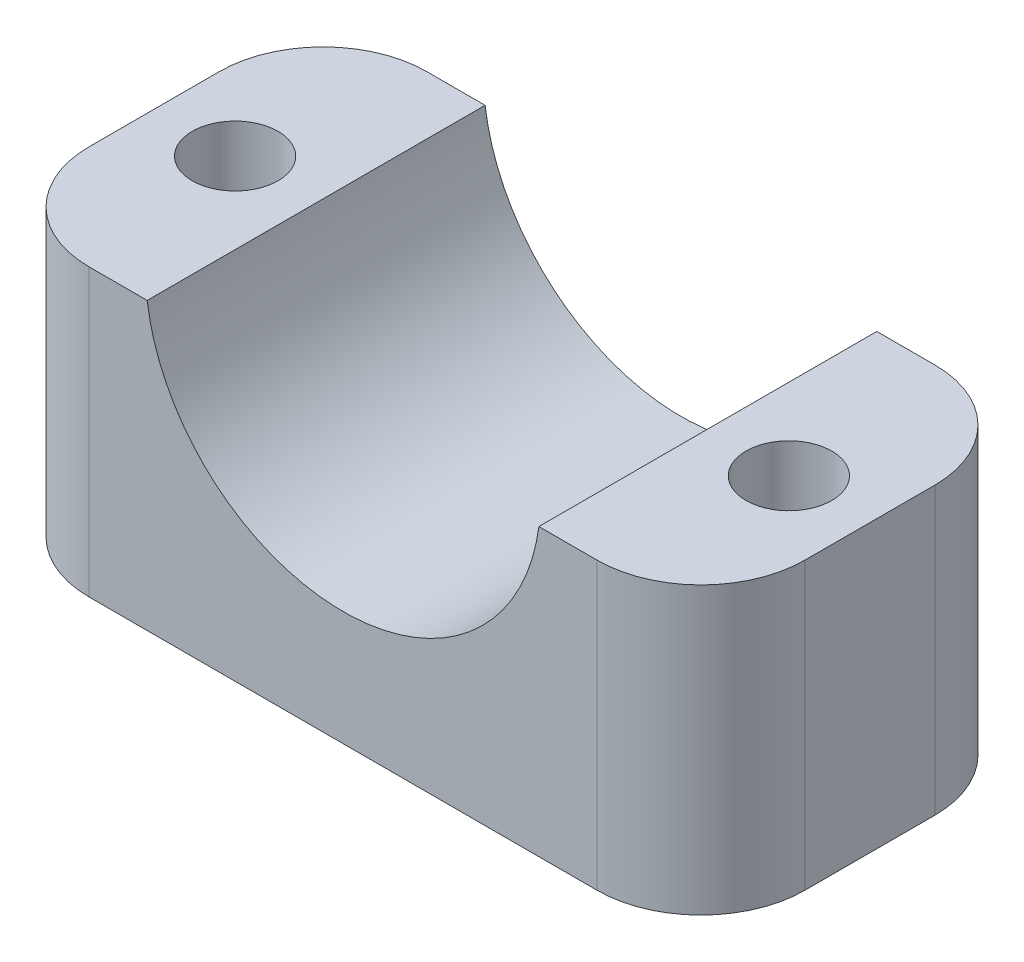
ISO-10303-21;
HEADER;
FILE_DESCRIPTION(('STEP AP214'),'2;1');
FILE_NAME('part.step','',(''),(''),'','','');
FILE_SCHEMA(('AUTOMOTIVE_DESIGN { 1 0 10303 214 1 1 1 1 }'));
ENDSEC;
DATA;
#1=APPLICATION_CONTEXT('core data for automotive mechanical design processes');
#2=APPLICATION_PROTOCOL_DEFINITION('international standard','automotive_design',2000,#1);
#3=PRODUCT_CONTEXT('',#1,'mechanical');
#4=PRODUCT('Part','Part','',(#3));
#5=PRODUCT_RELATED_PRODUCT_CATEGORY('part','',(#4));
#6=PRODUCT_DEFINITION_FORMATION('','',#4);
#7=PRODUCT_DEFINITION_CONTEXT('part definition',#1,'design');
#8=PRODUCT_DEFINITION('design','',#6,#7);
#9=PRODUCT_DEFINITION_SHAPE('','',#8);
#10=(LENGTH_UNIT() NAMED_UNIT(*) SI_UNIT(.MILLI.,.METRE.));
#11=(NAMED_UNIT(*) PLANE_ANGLE_UNIT() SI_UNIT($,.RADIAN.));
#12=(NAMED_UNIT(*) SI_UNIT($,.STERADIAN.) SOLID_ANGLE_UNIT());
#13=UNCERTAINTY_MEASURE_WITH_UNIT(LENGTH_MEASURE(1.E-05),#10,'distance_accuracy_value','');
#14=(GEOMETRIC_REPRESENTATION_CONTEXT(3) GLOBAL_UNCERTAINTY_ASSIGNED_CONTEXT((#13)) GLOBAL_UNIT_ASSIGNED_CONTEXT((#10,
#11,#12)) REPRESENTATION_CONTEXT('',''));
#15=CARTESIAN_POINT('',(0.,0.,0.));
#16=DIRECTION('',(0.,0.,1.));
#17=DIRECTION('',(1.,0.,0.));
#18=AXIS2_PLACEMENT_3D('',#15,#16,#17);
#19=CARTESIAN_POINT('',(0.,6.5,13.));
#20=DIRECTION('',(0.,0.,-1.));
#21=DIRECTION('',(-1.,0.,0.));
#22=AXIS2_PLACEMENT_3D('',#19,#20,#21);
#23=CYLINDRICAL_SURFACE('',#22,7.6);
#24=CARTESIAN_POINT('',(0.,6.5,0.));
#25=DIRECTION('',(0.,0.,1.));
#26=DIRECTION('',(1.,0.,0.));
#27=AXIS2_PLACEMENT_3D('',#24,#25,#26);
#28=CIRCLE('',#27,7.6);
#29=CARTESIAN_POINT('',(-7.53392328073495,5.5,0.));
#30=VERTEX_POINT('',#29);
#31=CARTESIAN_POINT('',(7.53392328073495,5.5,0.));
#32=VERTEX_POINT('',#31);
#33=EDGE_CURVE('E134',#30,#32,#28,.T.);
#34=ORIENTED_EDGE('',*,*,#33,.F.);
#35=DIRECTION('',(0.,0.,-1.));
#36=VECTOR('',#35,1.);
#37=CARTESIAN_POINT('',(-7.53392328073495,5.5,13.));
#38=LINE('',#37,#36);
#39=CARTESIAN_POINT('',(-7.53392328073495,5.5,13.));
#40=VERTEX_POINT('',#39);
#41=EDGE_CURVE('E122',#40,#30,#38,.T.);
#42=ORIENTED_EDGE('',*,*,#41,.F.);
#43=CARTESIAN_POINT('',(0.,6.5,13.));
#44=DIRECTION('',(0.,0.,1.));
#45=DIRECTION('',(1.,0.,0.));
#46=AXIS2_PLACEMENT_3D('',#43,#44,#45);
#47=CIRCLE('',#46,7.6);
#48=CARTESIAN_POINT('',(7.53392328073495,5.5,13.));
#49=VERTEX_POINT('',#48);
#50=EDGE_CURVE('E127',#40,#49,#47,.T.);
#51=ORIENTED_EDGE('',*,*,#50,.T.);
#52=DIRECTION('',(0.,0.,-1.));
#53=VECTOR('',#52,1.);
#54=CARTESIAN_POINT('',(7.53392328073495,5.5,13.));
#55=LINE('',#54,#53);
#56=EDGE_CURVE('E157',#49,#32,#55,.T.);
#57=ORIENTED_EDGE('',*,*,#56,.T.);
#58=EDGE_LOOP('',(#34,#42,#51,#57));
#59=FACE_BOUND('',#58,.T.);
#60=ADVANCED_FACE('F42',(#59),#23,.F.);
#61=CARTESIAN_POINT('',(0.,5.5,13.));
#62=DIRECTION('',(0.,1.,0.));
#63=DIRECTION('',(0.,0.,1.));
#64=AXIS2_PLACEMENT_3D('',#61,#62,#63);
#65=PLANE('',#64);
#66=CARTESIAN_POINT('',(-10.6519616403675,5.5,6.5));
#67=DIRECTION('',(0.,1.,0.));
#68=DIRECTION('',(0.,0.,1.));
#69=AXIS2_PLACEMENT_3D('',#66,#67,#68);
#70=CIRCLE('',#69,1.65);
#71=CARTESIAN_POINT('',(-10.6519616403675,5.5,8.15));
#72=VERTEX_POINT('',#71);
#73=EDGE_CURVE('E276',#72,#72,#70,.T.);
#74=ORIENTED_EDGE('',*,*,#73,.F.);
#75=EDGE_LOOP('',(#74));
#76=FACE_BOUND('',#75,.T.);
#77=DIRECTION('',(1.,0.,0.));
#78=VECTOR('',#77,1.);
#79=CARTESIAN_POINT('',(0.,5.5,0.));
#80=LINE('',#79,#78);
#81=CARTESIAN_POINT('',(-9.77,5.5,0.));
#82=VERTEX_POINT('',#81);
#83=EDGE_CURVE('E147',#82,#30,#80,.T.);
#84=ORIENTED_EDGE('',*,*,#83,.F.);
#85=CARTESIAN_POINT('',(-9.77,5.5,4.));
#86=DIRECTION('',(0.,1.,0.));
#87=DIRECTION('',(0.,0.,1.));
#88=AXIS2_PLACEMENT_3D('',#85,#86,#87);
#89=CIRCLE('',#88,4.);
#90=CARTESIAN_POINT('',(-13.77,5.5,4.));
#91=VERTEX_POINT('',#90);
#92=EDGE_CURVE('E57',#82,#91,#89,.T.);
#93=ORIENTED_EDGE('',*,*,#92,.T.);
#94=DIRECTION('',(0.,0.,-1.));
#95=VECTOR('',#94,1.);
#96=CARTESIAN_POINT('',(-13.77,5.5,13.));
#97=LINE('',#96,#95);
#98=CARTESIAN_POINT('',(-13.77,5.5,9.));
#99=VERTEX_POINT('',#98);
#100=EDGE_CURVE('E136',#99,#91,#97,.T.);
#101=ORIENTED_EDGE('',*,*,#100,.F.);
#102=CARTESIAN_POINT('',(-9.77,5.5,9.));
#103=DIRECTION('',(0.,1.,0.));
#104=DIRECTION('',(0.,0.,1.));
#105=AXIS2_PLACEMENT_3D('',#102,#103,#104);
#106=CIRCLE('',#105,4.);
#107=CARTESIAN_POINT('',(-9.77,5.5,13.));
#108=VERTEX_POINT('',#107);
#109=EDGE_CURVE('E65',#99,#108,#106,.T.);
#110=ORIENTED_EDGE('',*,*,#109,.T.);
#111=DIRECTION('',(1.,0.,0.));
#112=VECTOR('',#111,1.);
#113=CARTESIAN_POINT('',(0.,5.5,13.));
#114=LINE('',#113,#112);
#115=EDGE_CURVE('E119',#108,#40,#114,.T.);
#116=ORIENTED_EDGE('',*,*,#115,.T.);
#117=ORIENTED_EDGE('',*,*,#41,.T.);
#118=EDGE_LOOP('',(#84,#93,#101,#110,#116,#117));
#119=FACE_BOUND('',#118,.T.);
#120=ADVANCED_FACE('F121',(#76,#119),#65,.T.);
#121=CARTESIAN_POINT('',(-13.77,0.,13.));
#122=DIRECTION('',(-1.,0.,0.));
#123=DIRECTION('',(0.,0.,1.));
#124=AXIS2_PLACEMENT_3D('',#121,#122,#123);
#125=PLANE('',#124);
#126=ORIENTED_EDGE('',*,*,#100,.T.);
#127=DIRECTION('',(0.,1.,0.));
#128=VECTOR('',#127,1.);
#129=CARTESIAN_POINT('',(-13.77,-5.5,4.));
#130=LINE('',#129,#128);
#131=CARTESIAN_POINT('',(-13.77,-5.5,4.));
#132=VERTEX_POINT('',#131);
#133=EDGE_CURVE('E11',#91,#132,#130,.F.);
#134=ORIENTED_EDGE('',*,*,#133,.T.);
#135=DIRECTION('',(0.,0.,-1.));
#136=VECTOR('',#135,1.);
#137=CARTESIAN_POINT('',(-13.77,-5.5,13.));
#138=LINE('',#137,#136);
#139=CARTESIAN_POINT('',(-13.77,-5.5,9.));
#140=VERTEX_POINT('',#139);
#141=EDGE_CURVE('E165',#140,#132,#138,.T.);
#142=ORIENTED_EDGE('',*,*,#141,.F.);
#143=DIRECTION('',(0.,1.,0.));
#144=VECTOR('',#143,1.);
#145=CARTESIAN_POINT('',(-13.77,0.,9.));
#146=LINE('',#145,#144);
#147=EDGE_CURVE('E50',#140,#99,#146,.T.);
#148=ORIENTED_EDGE('',*,*,#147,.T.);
#149=EDGE_LOOP('',(#126,#134,#142,#148));
#150=FACE_BOUND('',#149,.T.);
#151=ADVANCED_FACE('F197',(#150),#125,.T.);
#152=CARTESIAN_POINT('',(0.,-5.5,13.));
#153=DIRECTION('',(0.,1.,0.));
#154=DIRECTION('',(0.,0.,1.));
#155=AXIS2_PLACEMENT_3D('',#152,#153,#154);
#156=PLANE('',#155);
#157=CARTESIAN_POINT('',(-10.6519616403675,-5.5,6.5));
#158=DIRECTION('',(0.,1.,0.));
#159=DIRECTION('',(0.,0.,1.));
#160=AXIS2_PLACEMENT_3D('',#157,#158,#159);
#161=CIRCLE('',#160,1.65);
#162=CARTESIAN_POINT('',(-10.6519616403675,-5.5,8.15));
#163=VERTEX_POINT('',#162);
#164=EDGE_CURVE('E153',#163,#163,#161,.T.);
#165=ORIENTED_EDGE('',*,*,#164,.T.);
#166=EDGE_LOOP('',(#165));
#167=FACE_BOUND('',#166,.T.);
#168=CARTESIAN_POINT('',(10.6519616403675,-5.5,6.5));
#169=DIRECTION('',(0.,1.,0.));
#170=DIRECTION('',(0.,0.,1.));
#171=AXIS2_PLACEMENT_3D('',#168,#169,#170);
#172=CIRCLE('',#171,1.65);
#173=CARTESIAN_POINT('',(10.6519616403675,-5.5,8.15));
#174=VERTEX_POINT('',#173);
#175=EDGE_CURVE('E275',#174,#174,#172,.T.);
#176=ORIENTED_EDGE('',*,*,#175,.T.);
#177=EDGE_LOOP('',(#176));
#178=FACE_BOUND('',#177,.T.);
#179=DIRECTION('',(0.,0.,-1.));
#180=VECTOR('',#179,1.);
#181=CARTESIAN_POINT('',(13.77,-5.5,13.));
#182=LINE('',#181,#180);
#183=CARTESIAN_POINT('',(13.77,-5.5,9.));
#184=VERTEX_POINT('',#183);
#185=CARTESIAN_POINT('',(13.77,-5.5,4.));
#186=VERTEX_POINT('',#185);
#187=EDGE_CURVE('E162',#184,#186,#182,.T.);
#188=ORIENTED_EDGE('',*,*,#187,.F.);
#189=CARTESIAN_POINT('',(9.77,-5.5,9.));
#190=DIRECTION('',(0.,1.,0.));
#191=DIRECTION('',(0.,0.,1.));
#192=AXIS2_PLACEMENT_3D('',#189,#190,#191);
#193=CIRCLE('',#192,4.);
#194=CARTESIAN_POINT('',(9.77,-5.5,13.));
#195=VERTEX_POINT('',#194);
#196=EDGE_CURVE('E187',#184,#195,#193,.F.);
#197=ORIENTED_EDGE('',*,*,#196,.T.);
#198=DIRECTION('',(1.,0.,0.));
#199=VECTOR('',#198,1.);
#200=CARTESIAN_POINT('',(0.,-5.5,13.));
#201=LINE('',#200,#199);
#202=CARTESIAN_POINT('',(-9.77,-5.5,13.));
#203=VERTEX_POINT('',#202);
#204=EDGE_CURVE('E126',#203,#195,#201,.T.);
#205=ORIENTED_EDGE('',*,*,#204,.F.);
#206=CARTESIAN_POINT('',(-9.77,-5.5,9.));
#207=DIRECTION('',(0.,1.,0.));
#208=DIRECTION('',(0.,0.,1.));
#209=AXIS2_PLACEMENT_3D('',#206,#207,#208);
#210=CIRCLE('',#209,4.);
#211=EDGE_CURVE('E181',#203,#140,#210,.F.);
#212=ORIENTED_EDGE('',*,*,#211,.T.);
#213=ORIENTED_EDGE('',*,*,#141,.T.);
#214=CARTESIAN_POINT('',(-9.77,-5.5,4.));
#215=DIRECTION('',(0.,1.,0.));
#216=DIRECTION('',(0.,0.,1.));
#217=AXIS2_PLACEMENT_3D('',#214,#215,#216);
#218=CIRCLE('',#217,4.);
#219=CARTESIAN_POINT('',(-9.77,-5.5,0.));
#220=VERTEX_POINT('',#219);
#221=EDGE_CURVE('E183',#132,#220,#218,.F.);
#222=ORIENTED_EDGE('',*,*,#221,.T.);
#223=DIRECTION('',(1.,0.,0.));
#224=VECTOR('',#223,1.);
#225=CARTESIAN_POINT('',(0.,-5.5,0.));
#226=LINE('',#225,#224);
#227=CARTESIAN_POINT('',(9.77,-5.5,0.));
#228=VERTEX_POINT('',#227);
#229=EDGE_CURVE('E145',#220,#228,#226,.T.);
#230=ORIENTED_EDGE('',*,*,#229,.T.);
#231=CARTESIAN_POINT('',(9.77,-5.5,4.));
#232=DIRECTION('',(0.,1.,0.));
#233=DIRECTION('',(0.,0.,1.));
#234=AXIS2_PLACEMENT_3D('',#231,#232,#233);
#235=CIRCLE('',#234,4.);
#236=EDGE_CURVE('E185',#228,#186,#235,.F.);
#237=ORIENTED_EDGE('',*,*,#236,.T.);
#238=EDGE_LOOP('',(#188,#197,#205,#212,#213,#222,#230,#237));
#239=FACE_BOUND('',#238,.T.);
#240=ADVANCED_FACE('F203',(#167,#178,#239),#156,.F.);
#241=CARTESIAN_POINT('',(13.77,0.,13.));
#242=DIRECTION('',(-1.,0.,0.));
#243=DIRECTION('',(0.,0.,1.));
#244=AXIS2_PLACEMENT_3D('',#241,#242,#243);
#245=PLANE('',#244);
#246=DIRECTION('',(0.,0.,-1.));
#247=VECTOR('',#246,1.);
#248=CARTESIAN_POINT('',(13.77,5.5,13.));
#249=LINE('',#248,#247);
#250=CARTESIAN_POINT('',(13.77,5.5,9.));
#251=VERTEX_POINT('',#250);
#252=CARTESIAN_POINT('',(13.77,5.5,4.));
#253=VERTEX_POINT('',#252);
#254=EDGE_CURVE('E159',#251,#253,#249,.T.);
#255=ORIENTED_EDGE('',*,*,#254,.F.);
#256=DIRECTION('',(0.,1.,0.));
#257=VECTOR('',#256,1.);
#258=CARTESIAN_POINT('',(13.77,-5.5,9.));
#259=LINE('',#258,#257);
#260=EDGE_CURVE('E179',#251,#184,#259,.F.);
#261=ORIENTED_EDGE('',*,*,#260,.T.);
#262=ORIENTED_EDGE('',*,*,#187,.T.);
#263=DIRECTION('',(0.,1.,0.));
#264=VECTOR('',#263,1.);
#265=CARTESIAN_POINT('',(13.77,0.,4.));
#266=LINE('',#265,#264);
#267=EDGE_CURVE('E176',#186,#253,#266,.T.);
#268=ORIENTED_EDGE('',*,*,#267,.T.);
#269=EDGE_LOOP('',(#255,#261,#262,#268));
#270=FACE_BOUND('',#269,.T.);
#271=ADVANCED_FACE('F214',(#270),#245,.F.);
#272=CARTESIAN_POINT('',(10.6519616403675,5.5,6.5));
#273=DIRECTION('',(0.,1.,0.));
#274=DIRECTION('',(0.,0.,1.));
#275=AXIS2_PLACEMENT_3D('',#272,#273,#274);
#276=CIRCLE('',#275,1.65);
#277=CARTESIAN_POINT('',(10.6519616403675,5.5,8.15));
#278=VERTEX_POINT('',#277);
#279=EDGE_CURVE('E149',#278,#278,#276,.T.);
#280=ORIENTED_EDGE('',*,*,#279,.F.);
#281=EDGE_LOOP('',(#280));
#282=FACE_BOUND('',#281,.T.);
#283=CARTESIAN_POINT('',(9.77,5.5,13.));
#284=VERTEX_POINT('',#283);
#285=EDGE_CURVE('E129',#49,#284,#114,.T.);
#286=ORIENTED_EDGE('',*,*,#285,.T.);
#287=CARTESIAN_POINT('',(9.77,5.5,9.));
#288=DIRECTION('',(0.,1.,0.));
#289=DIRECTION('',(0.,0.,1.));
#290=AXIS2_PLACEMENT_3D('',#287,#288,#289);
#291=CIRCLE('',#290,4.);
#292=EDGE_CURVE('E174',#284,#251,#291,.T.);
#293=ORIENTED_EDGE('',*,*,#292,.T.);
#294=ORIENTED_EDGE('',*,*,#254,.T.);
#295=CARTESIAN_POINT('',(9.77,5.5,4.));
#296=DIRECTION('',(0.,1.,0.));
#297=DIRECTION('',(0.,0.,1.));
#298=AXIS2_PLACEMENT_3D('',#295,#296,#297);
#299=CIRCLE('',#298,4.);
#300=CARTESIAN_POINT('',(9.77,5.5,0.));
#301=VERTEX_POINT('',#300);
#302=EDGE_CURVE('E172',#253,#301,#299,.T.);
#303=ORIENTED_EDGE('',*,*,#302,.T.);
#304=EDGE_CURVE('E142',#32,#301,#80,.T.);
#305=ORIENTED_EDGE('',*,*,#304,.F.);
#306=ORIENTED_EDGE('',*,*,#56,.F.);
#307=EDGE_LOOP('',(#286,#293,#294,#303,#305,#306));
#308=FACE_BOUND('',#307,.T.);
#309=ADVANCED_FACE('F212',(#282,#308),#65,.T.);
#310=CARTESIAN_POINT('',(0.,0.,13.));
#311=DIRECTION('',(0.,0.,1.));
#312=DIRECTION('',(1.,0.,0.));
#313=AXIS2_PLACEMENT_3D('',#310,#311,#312);
#314=PLANE('',#313);
#315=ORIENTED_EDGE('',*,*,#204,.T.);
#316=DIRECTION('',(0.,1.,0.));
#317=VECTOR('',#316,1.);
#318=CARTESIAN_POINT('',(9.77,5.5,13.));
#319=LINE('',#318,#317);
#320=EDGE_CURVE('E170',#195,#284,#319,.T.);
#321=ORIENTED_EDGE('',*,*,#320,.T.);
#322=ORIENTED_EDGE('',*,*,#285,.F.);
#323=ORIENTED_EDGE('',*,*,#50,.F.);
#324=ORIENTED_EDGE('',*,*,#115,.F.);
#325=DIRECTION('',(0.,1.,0.));
#326=VECTOR('',#325,1.);
#327=CARTESIAN_POINT('',(-9.77,0.,13.));
#328=LINE('',#327,#326);
#329=EDGE_CURVE('E135',#108,#203,#328,.F.);
#330=ORIENTED_EDGE('',*,*,#329,.T.);
#331=EDGE_LOOP('',(#315,#321,#322,#323,#324,#330));
#332=FACE_BOUND('',#331,.T.);
#333=ADVANCED_FACE('F139',(#332),#314,.T.);
#334=CARTESIAN_POINT('',(0.,0.,0.));
#335=DIRECTION('',(0.,0.,1.));
#336=DIRECTION('',(1.,0.,0.));
#337=AXIS2_PLACEMENT_3D('',#334,#335,#336);
#338=PLANE('',#337);
#339=ORIENTED_EDGE('',*,*,#304,.T.);
#340=DIRECTION('',(0.,1.,0.));
#341=VECTOR('',#340,1.);
#342=CARTESIAN_POINT('',(9.77,0.,0.));
#343=LINE('',#342,#341);
#344=EDGE_CURVE('E192',#301,#228,#343,.F.);
#345=ORIENTED_EDGE('',*,*,#344,.T.);
#346=ORIENTED_EDGE('',*,*,#229,.F.);
#347=DIRECTION('',(0.,1.,0.));
#348=VECTOR('',#347,1.);
#349=CARTESIAN_POINT('',(-9.77,5.5,0.));
#350=LINE('',#349,#348);
#351=EDGE_CURVE('E189',#220,#82,#350,.T.);
#352=ORIENTED_EDGE('',*,*,#351,.T.);
#353=ORIENTED_EDGE('',*,*,#83,.T.);
#354=ORIENTED_EDGE('',*,*,#33,.T.);
#355=EDGE_LOOP('',(#339,#345,#346,#352,#353,#354));
#356=FACE_BOUND('',#355,.T.);
#357=ADVANCED_FACE('F222',(#356),#338,.F.);
#358=CARTESIAN_POINT('',(10.6519616403675,-5.5,6.5));
#359=DIRECTION('',(0.,1.,0.));
#360=DIRECTION('',(0.,0.,1.));
#361=AXIS2_PLACEMENT_3D('',#358,#359,#360);
#362=CYLINDRICAL_SURFACE('',#361,1.65);
#363=ORIENTED_EDGE('',*,*,#175,.F.);
#364=EDGE_LOOP('',(#363));
#365=FACE_BOUND('',#364,.T.);
#366=ORIENTED_EDGE('',*,*,#279,.T.);
#367=EDGE_LOOP('',(#366));
#368=FACE_BOUND('',#367,.T.);
#369=ADVANCED_FACE('F248',(#365,#368),#362,.F.);
#370=CARTESIAN_POINT('',(-10.6519616403675,-5.5,6.5));
#371=DIRECTION('',(0.,1.,0.));
#372=DIRECTION('',(0.,0.,1.));
#373=AXIS2_PLACEMENT_3D('',#370,#371,#372);
#374=CYLINDRICAL_SURFACE('',#373,1.65);
#375=ORIENTED_EDGE('',*,*,#164,.F.);
#376=EDGE_LOOP('',(#375));
#377=FACE_BOUND('',#376,.T.);
#378=ORIENTED_EDGE('',*,*,#73,.T.);
#379=EDGE_LOOP('',(#378));
#380=FACE_BOUND('',#379,.T.);
#381=ADVANCED_FACE('F244',(#377,#380),#374,.F.);
#382=CARTESIAN_POINT('',(9.77,0.,9.));
#383=DIRECTION('',(0.,-1.,0.));
#384=DIRECTION('',(0.,0.,-1.));
#385=AXIS2_PLACEMENT_3D('',#382,#383,#384);
#386=CYLINDRICAL_SURFACE('',#385,4.);
#387=ORIENTED_EDGE('',*,*,#196,.F.);
#388=ORIENTED_EDGE('',*,*,#260,.F.);
#389=ORIENTED_EDGE('',*,*,#292,.F.);
#390=ORIENTED_EDGE('',*,*,#320,.F.);
#391=EDGE_LOOP('',(#387,#388,#389,#390));
#392=FACE_BOUND('',#391,.T.);
#393=ADVANCED_FACE('F208',(#392),#386,.T.);
#394=CARTESIAN_POINT('',(9.77,0.,4.));
#395=DIRECTION('',(0.,1.,0.));
#396=DIRECTION('',(0.,0.,1.));
#397=AXIS2_PLACEMENT_3D('',#394,#395,#396);
#398=CYLINDRICAL_SURFACE('',#397,4.);
#399=ORIENTED_EDGE('',*,*,#236,.F.);
#400=ORIENTED_EDGE('',*,*,#344,.F.);
#401=ORIENTED_EDGE('',*,*,#302,.F.);
#402=ORIENTED_EDGE('',*,*,#267,.F.);
#403=EDGE_LOOP('',(#399,#400,#401,#402));
#404=FACE_BOUND('',#403,.T.);
#405=ADVANCED_FACE('F218',(#404),#398,.T.);
#406=CARTESIAN_POINT('',(-9.77,0.,4.));
#407=DIRECTION('',(0.,-1.,0.));
#408=DIRECTION('',(0.,0.,-1.));
#409=AXIS2_PLACEMENT_3D('',#406,#407,#408);
#410=CYLINDRICAL_SURFACE('',#409,4.);
#411=ORIENTED_EDGE('',*,*,#221,.F.);
#412=ORIENTED_EDGE('',*,*,#133,.F.);
#413=ORIENTED_EDGE('',*,*,#92,.F.);
#414=ORIENTED_EDGE('',*,*,#351,.F.);
#415=EDGE_LOOP('',(#411,#412,#413,#414));
#416=FACE_BOUND('',#415,.T.);
#417=ADVANCED_FACE('F226',(#416),#410,.T.);
#418=CARTESIAN_POINT('',(-9.77,0.,9.));
#419=DIRECTION('',(0.,1.,0.));
#420=DIRECTION('',(0.,0.,1.));
#421=AXIS2_PLACEMENT_3D('',#418,#419,#420);
#422=CYLINDRICAL_SURFACE('',#421,4.);
#423=ORIENTED_EDGE('',*,*,#211,.F.);
#424=ORIENTED_EDGE('',*,*,#329,.F.);
#425=ORIENTED_EDGE('',*,*,#109,.F.);
#426=ORIENTED_EDGE('',*,*,#147,.F.);
#427=EDGE_LOOP('',(#423,#424,#425,#426));
#428=FACE_BOUND('',#427,.T.);
#429=ADVANCED_FACE('F44',(#428),#422,.T.);
#430=CLOSED_SHELL('',(#60,#120,#151,#240,#271,#309,#333,#357,#369,#381,#393,#405,#417,#429));
#431=MANIFOLD_SOLID_BREP('B2',#430);
#432=ADVANCED_BREP_SHAPE_REPRESENTATION('',(#18,#431),#14);
#433=SHAPE_DEFINITION_REPRESENTATION(#9,#432);
ENDSEC;
END-ISO-10303-21;
